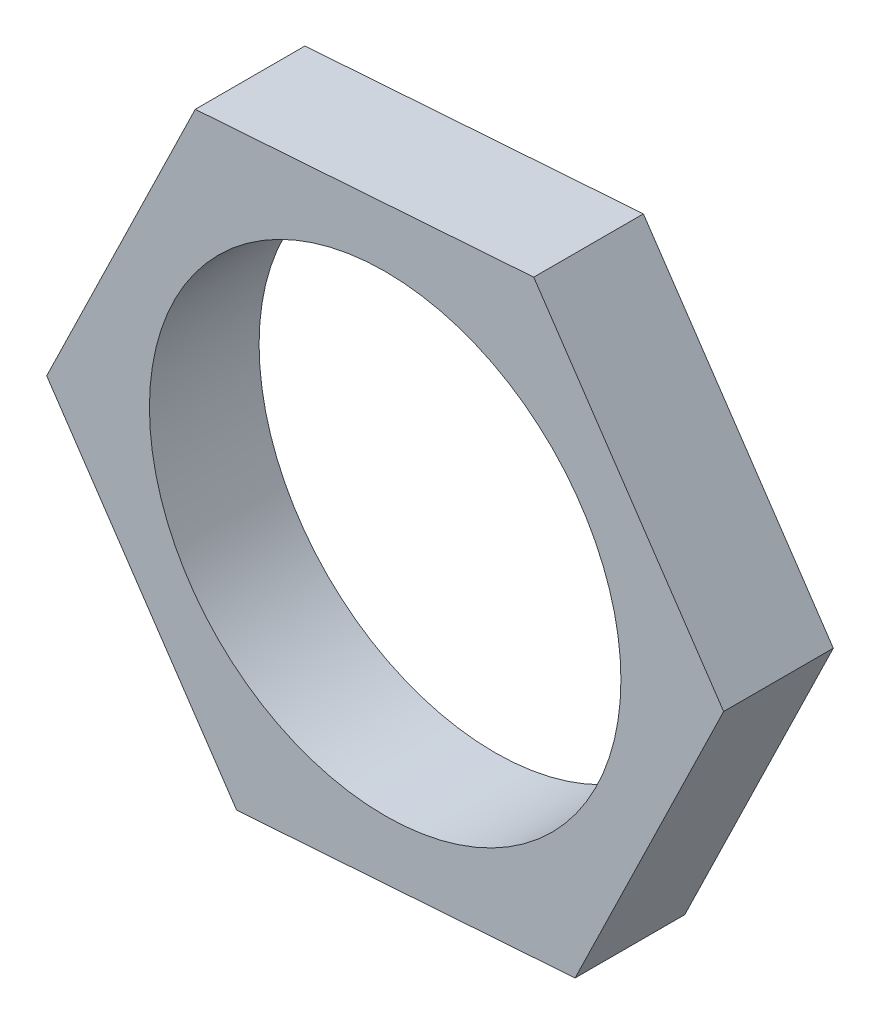
ISO-10303-21;
HEADER;
FILE_DESCRIPTION(('STEP AP214'),'2;1');
FILE_NAME('part.step','',(''),(''),'','','');
FILE_SCHEMA(('AUTOMOTIVE_DESIGN { 1 0 10303 214 1 1 1 1 }'));
ENDSEC;
DATA;
#1=APPLICATION_CONTEXT('core data for automotive mechanical design processes');
#2=APPLICATION_PROTOCOL_DEFINITION('international standard','automotive_design',2000,#1);
#3=PRODUCT_CONTEXT('',#1,'mechanical');
#4=PRODUCT('Part','Part','',(#3));
#5=PRODUCT_RELATED_PRODUCT_CATEGORY('part','',(#4));
#6=PRODUCT_DEFINITION_FORMATION('','',#4);
#7=PRODUCT_DEFINITION_CONTEXT('part definition',#1,'design');
#8=PRODUCT_DEFINITION('design','',#6,#7);
#9=PRODUCT_DEFINITION_SHAPE('','',#8);
#10=(LENGTH_UNIT() NAMED_UNIT(*) SI_UNIT(.MILLI.,.METRE.));
#11=(NAMED_UNIT(*) PLANE_ANGLE_UNIT() SI_UNIT($,.RADIAN.));
#12=(NAMED_UNIT(*) SI_UNIT($,.STERADIAN.) SOLID_ANGLE_UNIT());
#13=UNCERTAINTY_MEASURE_WITH_UNIT(LENGTH_MEASURE(1.E-05),#10,'distance_accuracy_value','');
#14=(GEOMETRIC_REPRESENTATION_CONTEXT(3) GLOBAL_UNCERTAINTY_ASSIGNED_CONTEXT((#13)) GLOBAL_UNIT_ASSIGNED_CONTEXT((#10,
#11,#12)) REPRESENTATION_CONTEXT('',''));
#15=CARTESIAN_POINT('',(0.,0.,0.));
#16=DIRECTION('',(0.,0.,1.));
#17=DIRECTION('',(1.,0.,0.));
#18=AXIS2_PLACEMENT_3D('',#15,#16,#17);
#19=CARTESIAN_POINT('',(0.,0.,5.));
#20=DIRECTION('',(0.,0.,1.));
#21=DIRECTION('',(1.,0.,0.));
#22=AXIS2_PLACEMENT_3D('',#19,#20,#21);
#23=PLANE('',#22);
#24=DIRECTION('',(-0.559694197763869,0.828699224682549,0.));
#25=VECTOR('',#24,1.);
#26=CARTESIAN_POINT('',(15.4346401937002,1.08867599603661,5.));
#27=LINE('',#26,#25);
#28=CARTESIAN_POINT('',(15.4346401937002,1.08867599603661,5.));
#29=VERTEX_POINT('',#28);
#30=CARTESIAN_POINT('',(6.77449902779209,13.9111285040351,5.));
#31=VERTEX_POINT('',#30);
#32=EDGE_CURVE('E132',#29,#31,#27,.T.);
#33=ORIENTED_EDGE('',*,*,#32,.T.);
#34=DIRECTION('',(-0.997521679553491,-0.0703597812729877,0.));
#35=VECTOR('',#34,1.);
#36=CARTESIAN_POINT('',(6.77449902779209,13.9111285040351,5.));
#37=LINE('',#36,#35);
#38=CARTESIAN_POINT('',(-8.66014116590815,12.8224525079985,5.));
#39=VERTEX_POINT('',#38);
#40=EDGE_CURVE('E90',#31,#39,#37,.T.);
#41=ORIENTED_EDGE('',*,*,#40,.T.);
#42=DIRECTION('',(-0.437827481789622,-0.899059005955537,0.));
#43=VECTOR('',#42,1.);
#44=CARTESIAN_POINT('',(-8.66014116590815,12.8224525079985,5.));
#45=LINE('',#44,#43);
#46=CARTESIAN_POINT('',(-15.4346401937002,-1.08867599603661,5.));
#47=VERTEX_POINT('',#46);
#48=EDGE_CURVE('E103',#39,#47,#45,.T.);
#49=ORIENTED_EDGE('',*,*,#48,.T.);
#50=DIRECTION('',(0.559694197763869,-0.82869922468255,0.));
#51=VECTOR('',#50,1.);
#52=CARTESIAN_POINT('',(-15.4346401937002,-1.08867599603661,5.));
#53=LINE('',#52,#51);
#54=CARTESIAN_POINT('',(-6.77449902779209,-13.9111285040351,5.));
#55=VERTEX_POINT('',#54);
#56=EDGE_CURVE('E97',#47,#55,#53,.T.);
#57=ORIENTED_EDGE('',*,*,#56,.T.);
#58=DIRECTION('',(0.997521679553491,0.0703597812729878,0.));
#59=VECTOR('',#58,1.);
#60=CARTESIAN_POINT('',(-6.77449902779209,-13.9111285040351,5.));
#61=LINE('',#60,#59);
#62=CARTESIAN_POINT('',(8.66014116590815,-12.8224525079985,5.));
#63=VERTEX_POINT('',#62);
#64=EDGE_CURVE('E101',#55,#63,#61,.T.);
#65=ORIENTED_EDGE('',*,*,#64,.T.);
#66=DIRECTION('',(0.437827481789622,0.899059005955537,0.));
#67=VECTOR('',#66,1.);
#68=CARTESIAN_POINT('',(8.66014116590815,-12.8224525079985,5.));
#69=LINE('',#68,#67);
#70=EDGE_CURVE('E53',#63,#29,#69,.T.);
#71=ORIENTED_EDGE('',*,*,#70,.T.);
#72=EDGE_LOOP('',(#33,#41,#49,#57,#65,#71));
#73=FACE_BOUND('',#72,.T.);
#74=CARTESIAN_POINT('',(0.,0.,5.));
#75=DIRECTION('',(0.,0.,1.));
#76=DIRECTION('',(1.,0.,0.));
#77=AXIS2_PLACEMENT_3D('',#74,#75,#76);
#78=CIRCLE('',#77,10.75);
#79=CARTESIAN_POINT('',(10.75,0.,5.));
#80=VERTEX_POINT('',#79);
#81=EDGE_CURVE('E125',#80,#80,#78,.T.);
#82=ORIENTED_EDGE('',*,*,#81,.F.);
#83=EDGE_LOOP('',(#82));
#84=FACE_BOUND('',#83,.T.);
#85=ADVANCED_FACE('F36',(#73,#84),#23,.T.);
#86=CARTESIAN_POINT('',(0.,0.,0.));
#87=DIRECTION('',(0.,0.,1.));
#88=DIRECTION('',(1.,0.,0.));
#89=AXIS2_PLACEMENT_3D('',#86,#87,#88);
#90=PLANE('',#89);
#91=DIRECTION('',(-0.559694197763869,0.828699224682549,0.));
#92=VECTOR('',#91,1.);
#93=CARTESIAN_POINT('',(15.4346401937002,1.08867599603661,0.));
#94=LINE('',#93,#92);
#95=CARTESIAN_POINT('',(15.4346401937002,1.08867599603661,0.));
#96=VERTEX_POINT('',#95);
#97=CARTESIAN_POINT('',(6.77449902779209,13.9111285040351,0.));
#98=VERTEX_POINT('',#97);
#99=EDGE_CURVE('E121',#96,#98,#94,.T.);
#100=ORIENTED_EDGE('',*,*,#99,.F.);
#101=DIRECTION('',(0.437827481789622,0.899059005955537,0.));
#102=VECTOR('',#101,1.);
#103=CARTESIAN_POINT('',(8.66014116590815,-12.8224525079985,0.));
#104=LINE('',#103,#102);
#105=CARTESIAN_POINT('',(8.66014116590815,-12.8224525079985,0.));
#106=VERTEX_POINT('',#105);
#107=EDGE_CURVE('E82',#106,#96,#104,.T.);
#108=ORIENTED_EDGE('',*,*,#107,.F.);
#109=DIRECTION('',(0.997521679553491,0.0703597812729878,0.));
#110=VECTOR('',#109,1.);
#111=CARTESIAN_POINT('',(-6.77449902779209,-13.9111285040351,0.));
#112=LINE('',#111,#110);
#113=CARTESIAN_POINT('',(-6.77449902779209,-13.9111285040351,0.));
#114=VERTEX_POINT('',#113);
#115=EDGE_CURVE('E76',#114,#106,#112,.T.);
#116=ORIENTED_EDGE('',*,*,#115,.F.);
#117=DIRECTION('',(0.559694197763869,-0.82869922468255,0.));
#118=VECTOR('',#117,1.);
#119=CARTESIAN_POINT('',(-15.4346401937002,-1.08867599603661,0.));
#120=LINE('',#119,#118);
#121=CARTESIAN_POINT('',(-15.4346401937002,-1.08867599603661,0.));
#122=VERTEX_POINT('',#121);
#123=EDGE_CURVE('E111',#122,#114,#120,.T.);
#124=ORIENTED_EDGE('',*,*,#123,.F.);
#125=DIRECTION('',(-0.437827481789622,-0.899059005955537,0.));
#126=VECTOR('',#125,1.);
#127=CARTESIAN_POINT('',(-8.66014116590815,12.8224525079985,0.));
#128=LINE('',#127,#126);
#129=CARTESIAN_POINT('',(-8.66014116590815,12.8224525079985,0.));
#130=VERTEX_POINT('',#129);
#131=EDGE_CURVE('E127',#130,#122,#128,.T.);
#132=ORIENTED_EDGE('',*,*,#131,.F.);
#133=DIRECTION('',(-0.997521679553491,-0.0703597812729877,0.));
#134=VECTOR('',#133,1.);
#135=CARTESIAN_POINT('',(6.77449902779209,13.9111285040351,0.));
#136=LINE('',#135,#134);
#137=EDGE_CURVE('E124',#98,#130,#136,.T.);
#138=ORIENTED_EDGE('',*,*,#137,.F.);
#139=EDGE_LOOP('',(#100,#108,#116,#124,#132,#138));
#140=FACE_BOUND('',#139,.T.);
#141=CARTESIAN_POINT('',(0.,0.,0.));
#142=DIRECTION('',(0.,0.,1.));
#143=DIRECTION('',(1.,0.,0.));
#144=AXIS2_PLACEMENT_3D('',#141,#142,#143);
#145=CIRCLE('',#144,10.75);
#146=CARTESIAN_POINT('',(10.75,0.,0.));
#147=VERTEX_POINT('',#146);
#148=EDGE_CURVE('E225',#147,#147,#145,.T.);
#149=ORIENTED_EDGE('',*,*,#148,.T.);
#150=EDGE_LOOP('',(#149));
#151=FACE_BOUND('',#150,.T.);
#152=ADVANCED_FACE('F141',(#140,#151),#90,.F.);
#153=CARTESIAN_POINT('',(15.4346401937002,1.08867599603661,5.));
#154=DIRECTION('',(-0.82869922468255,-0.559694197763869,0.));
#155=DIRECTION('',(0.559694197763869,-0.82869922468255,0.));
#156=AXIS2_PLACEMENT_3D('',#153,#154,#155);
#157=PLANE('',#156);
#158=ORIENTED_EDGE('',*,*,#99,.T.);
#159=DIRECTION('',(0.,0.,-1.));
#160=VECTOR('',#159,1.);
#161=CARTESIAN_POINT('',(6.77449902779209,13.9111285040351,5.));
#162=LINE('',#161,#160);
#163=EDGE_CURVE('E11',#31,#98,#162,.T.);
#164=ORIENTED_EDGE('',*,*,#163,.F.);
#165=ORIENTED_EDGE('',*,*,#32,.F.);
#166=DIRECTION('',(0.,0.,-1.));
#167=VECTOR('',#166,1.);
#168=CARTESIAN_POINT('',(15.4346401937002,1.08867599603661,5.));
#169=LINE('',#168,#167);
#170=EDGE_CURVE('E117',#29,#96,#169,.T.);
#171=ORIENTED_EDGE('',*,*,#170,.T.);
#172=EDGE_LOOP('',(#158,#164,#165,#171));
#173=FACE_BOUND('',#172,.T.);
#174=ADVANCED_FACE('F38',(#173),#157,.F.);
#175=CARTESIAN_POINT('',(6.77449902779209,13.9111285040351,5.));
#176=DIRECTION('',(0.0703597812729877,-0.997521679553491,0.));
#177=DIRECTION('',(0.997521679553491,0.0703597812729877,0.));
#178=AXIS2_PLACEMENT_3D('',#175,#176,#177);
#179=PLANE('',#178);
#180=ORIENTED_EDGE('',*,*,#137,.T.);
#181=DIRECTION('',(0.,0.,-1.));
#182=VECTOR('',#181,1.);
#183=CARTESIAN_POINT('',(-8.66014116590815,12.8224525079985,5.));
#184=LINE('',#183,#182);
#185=EDGE_CURVE('E45',#39,#130,#184,.T.);
#186=ORIENTED_EDGE('',*,*,#185,.F.);
#187=ORIENTED_EDGE('',*,*,#40,.F.);
#188=ORIENTED_EDGE('',*,*,#163,.T.);
#189=EDGE_LOOP('',(#180,#186,#187,#188));
#190=FACE_BOUND('',#189,.T.);
#191=ADVANCED_FACE('F166',(#190),#179,.F.);
#192=CARTESIAN_POINT('',(-8.66014116590815,12.8224525079985,5.));
#193=DIRECTION('',(0.899059005955537,-0.437827481789622,0.));
#194=DIRECTION('',(0.437827481789622,0.899059005955537,0.));
#195=AXIS2_PLACEMENT_3D('',#192,#193,#194);
#196=PLANE('',#195);
#197=ORIENTED_EDGE('',*,*,#131,.T.);
#198=DIRECTION('',(0.,0.,-1.));
#199=VECTOR('',#198,1.);
#200=CARTESIAN_POINT('',(-15.4346401937002,-1.08867599603661,5.));
#201=LINE('',#200,#199);
#202=EDGE_CURVE('E112',#47,#122,#201,.T.);
#203=ORIENTED_EDGE('',*,*,#202,.F.);
#204=ORIENTED_EDGE('',*,*,#48,.F.);
#205=ORIENTED_EDGE('',*,*,#185,.T.);
#206=EDGE_LOOP('',(#197,#203,#204,#205));
#207=FACE_BOUND('',#206,.T.);
#208=ADVANCED_FACE('F138',(#207),#196,.F.);
#209=CARTESIAN_POINT('',(-15.4346401937002,-1.08867599603661,5.));
#210=DIRECTION('',(0.82869922468255,0.559694197763869,0.));
#211=DIRECTION('',(-0.559694197763869,0.82869922468255,0.));
#212=AXIS2_PLACEMENT_3D('',#209,#210,#211);
#213=PLANE('',#212);
#214=ORIENTED_EDGE('',*,*,#123,.T.);
#215=DIRECTION('',(0.,0.,-1.));
#216=VECTOR('',#215,1.);
#217=CARTESIAN_POINT('',(-6.77449902779209,-13.9111285040351,5.));
#218=LINE('',#217,#216);
#219=EDGE_CURVE('E108',#55,#114,#218,.T.);
#220=ORIENTED_EDGE('',*,*,#219,.F.);
#221=ORIENTED_EDGE('',*,*,#56,.F.);
#222=ORIENTED_EDGE('',*,*,#202,.T.);
#223=EDGE_LOOP('',(#214,#220,#221,#222));
#224=FACE_BOUND('',#223,.T.);
#225=ADVANCED_FACE('F109',(#224),#213,.F.);
#226=CARTESIAN_POINT('',(-6.77449902779209,-13.9111285040351,5.));
#227=DIRECTION('',(-0.0703597812729878,0.997521679553491,0.));
#228=DIRECTION('',(-0.997521679553491,-0.0703597812729878,0.));
#229=AXIS2_PLACEMENT_3D('',#226,#227,#228);
#230=PLANE('',#229);
#231=ORIENTED_EDGE('',*,*,#115,.T.);
#232=DIRECTION('',(0.,0.,-1.));
#233=VECTOR('',#232,1.);
#234=CARTESIAN_POINT('',(8.66014116590815,-12.8224525079985,5.));
#235=LINE('',#234,#233);
#236=EDGE_CURVE('E113',#63,#106,#235,.T.);
#237=ORIENTED_EDGE('',*,*,#236,.F.);
#238=ORIENTED_EDGE('',*,*,#64,.F.);
#239=ORIENTED_EDGE('',*,*,#219,.T.);
#240=EDGE_LOOP('',(#231,#237,#238,#239));
#241=FACE_BOUND('',#240,.T.);
#242=ADVANCED_FACE('F115',(#241),#230,.F.);
#243=CARTESIAN_POINT('',(8.66014116590815,-12.8224525079985,5.));
#244=DIRECTION('',(-0.899059005955537,0.437827481789622,0.));
#245=DIRECTION('',(-0.437827481789622,-0.899059005955537,0.));
#246=AXIS2_PLACEMENT_3D('',#243,#244,#245);
#247=PLANE('',#246);
#248=ORIENTED_EDGE('',*,*,#107,.T.);
#249=ORIENTED_EDGE('',*,*,#170,.F.);
#250=ORIENTED_EDGE('',*,*,#70,.F.);
#251=ORIENTED_EDGE('',*,*,#236,.T.);
#252=EDGE_LOOP('',(#248,#249,#250,#251));
#253=FACE_BOUND('',#252,.T.);
#254=ADVANCED_FACE('F146',(#253),#247,.F.);
#255=CARTESIAN_POINT('',(0.,0.,5.));
#256=DIRECTION('',(0.,0.,-1.));
#257=DIRECTION('',(-1.,0.,0.));
#258=AXIS2_PLACEMENT_3D('',#255,#256,#257);
#259=CYLINDRICAL_SURFACE('',#258,10.75);
#260=ORIENTED_EDGE('',*,*,#81,.T.);
#261=EDGE_LOOP('',(#260));
#262=FACE_BOUND('',#261,.T.);
#263=ORIENTED_EDGE('',*,*,#148,.F.);
#264=EDGE_LOOP('',(#263));
#265=FACE_BOUND('',#264,.T.);
#266=ADVANCED_FACE('F148',(#262,#265),#259,.F.);
#267=CLOSED_SHELL('',(#85,#152,#174,#191,#208,#225,#242,#254,#266));
#268=MANIFOLD_SOLID_BREP('B2',#267);
#269=ADVANCED_BREP_SHAPE_REPRESENTATION('',(#18,#268),#14);
#270=SHAPE_DEFINITION_REPRESENTATION(#9,#269);
ENDSEC;
END-ISO-10303-21;
